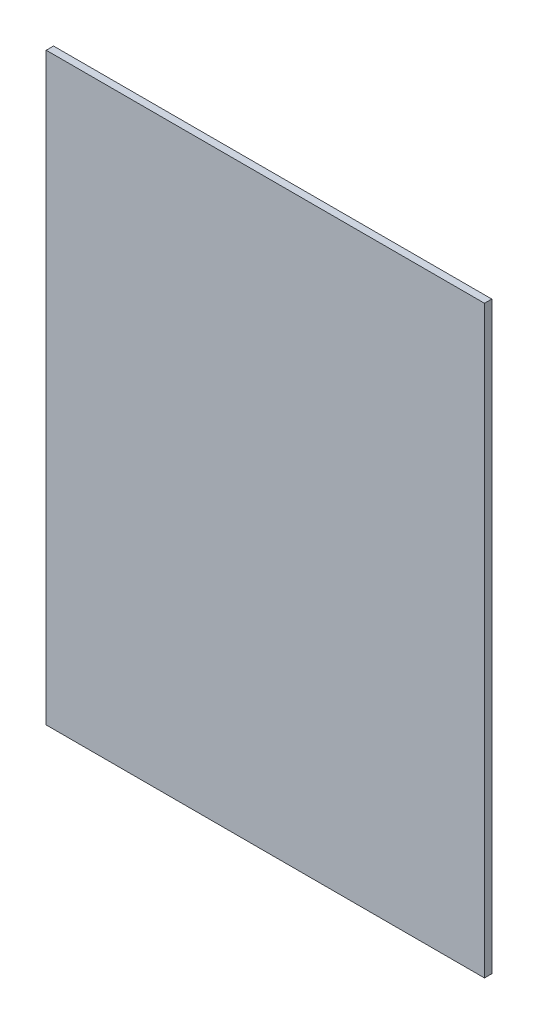
ISO-10303-21;
HEADER;
FILE_DESCRIPTION(('STEP AP214'),'2;1');
FILE_NAME('part.step','',(''),(''),'','','');
FILE_SCHEMA(('AUTOMOTIVE_DESIGN { 1 0 10303 214 1 1 1 1 }'));
ENDSEC;
DATA;
#1=APPLICATION_CONTEXT('core data for automotive mechanical design processes');
#2=APPLICATION_PROTOCOL_DEFINITION('international standard','automotive_design',2000,#1);
#3=PRODUCT_CONTEXT('',#1,'mechanical');
#4=PRODUCT('Part','Part','',(#3));
#5=PRODUCT_RELATED_PRODUCT_CATEGORY('part','',(#4));
#6=PRODUCT_DEFINITION_FORMATION('','',#4);
#7=PRODUCT_DEFINITION_CONTEXT('part definition',#1,'design');
#8=PRODUCT_DEFINITION('design','',#6,#7);
#9=PRODUCT_DEFINITION_SHAPE('','',#8);
#10=(LENGTH_UNIT() NAMED_UNIT(*) SI_UNIT(.MILLI.,.METRE.));
#11=(NAMED_UNIT(*) PLANE_ANGLE_UNIT() SI_UNIT($,.RADIAN.));
#12=(NAMED_UNIT(*) SI_UNIT($,.STERADIAN.) SOLID_ANGLE_UNIT());
#13=UNCERTAINTY_MEASURE_WITH_UNIT(LENGTH_MEASURE(1.E-05),#10,'distance_accuracy_value','');
#14=(GEOMETRIC_REPRESENTATION_CONTEXT(3) GLOBAL_UNCERTAINTY_ASSIGNED_CONTEXT((#13)) GLOBAL_UNIT_ASSIGNED_CONTEXT((#10,
#11,#12)) REPRESENTATION_CONTEXT('',''));
#15=CARTESIAN_POINT('',(0.,0.,0.));
#16=DIRECTION('',(0.,0.,1.));
#17=DIRECTION('',(1.,0.,0.));
#18=AXIS2_PLACEMENT_3D('',#15,#16,#17);
#19=CARTESIAN_POINT('',(-250.,400.,10.));
#20=DIRECTION('',(1.,0.,0.));
#21=DIRECTION('',(0.,1.,0.));
#22=AXIS2_PLACEMENT_3D('',#19,#20,#21);
#23=PLANE('',#22);
#24=DIRECTION('',(0.,-1.,0.));
#25=VECTOR('',#24,1.);
#26=CARTESIAN_POINT('',(-250.,400.,0.));
#27=LINE('',#26,#25);
#28=CARTESIAN_POINT('',(-250.,400.,0.));
#29=VERTEX_POINT('',#28);
#30=CARTESIAN_POINT('',(-250.,-400.,0.));
#31=VERTEX_POINT('',#30);
#32=EDGE_CURVE('E100',#29,#31,#27,.T.);
#33=ORIENTED_EDGE('',*,*,#32,.T.);
#34=DIRECTION('',(0.,0.,-1.));
#35=VECTOR('',#34,1.);
#36=CARTESIAN_POINT('',(-250.,-400.,10.));
#37=LINE('',#36,#35);
#38=CARTESIAN_POINT('',(-250.,-400.,10.));
#39=VERTEX_POINT('',#38);
#40=EDGE_CURVE('E11',#39,#31,#37,.T.);
#41=ORIENTED_EDGE('',*,*,#40,.F.);
#42=DIRECTION('',(0.,-1.,0.));
#43=VECTOR('',#42,1.);
#44=CARTESIAN_POINT('',(-250.,400.,10.));
#45=LINE('',#44,#43);
#46=CARTESIAN_POINT('',(-250.,400.,10.));
#47=VERTEX_POINT('',#46);
#48=EDGE_CURVE('E88',#47,#39,#45,.T.);
#49=ORIENTED_EDGE('',*,*,#48,.F.);
#50=DIRECTION('',(0.,0.,-1.));
#51=VECTOR('',#50,1.);
#52=CARTESIAN_POINT('',(-250.,400.,10.));
#53=LINE('',#52,#51);
#54=EDGE_CURVE('E96',#47,#29,#53,.T.);
#55=ORIENTED_EDGE('',*,*,#54,.T.);
#56=EDGE_LOOP('',(#33,#41,#49,#55));
#57=FACE_BOUND('',#56,.T.);
#58=ADVANCED_FACE('F37',(#57),#23,.F.);
#59=CARTESIAN_POINT('',(-250.,-400.,10.));
#60=DIRECTION('',(0.,1.,0.));
#61=DIRECTION('',(0.,0.,1.));
#62=AXIS2_PLACEMENT_3D('',#59,#60,#61);
#63=PLANE('',#62);
#64=DIRECTION('',(1.,0.,0.));
#65=VECTOR('',#64,1.);
#66=CARTESIAN_POINT('',(-250.,-400.,0.));
#67=LINE('',#66,#65);
#68=CARTESIAN_POINT('',(350.,-400.,0.));
#69=VERTEX_POINT('',#68);
#70=EDGE_CURVE('E92',#31,#69,#67,.T.);
#71=ORIENTED_EDGE('',*,*,#70,.T.);
#72=DIRECTION('',(0.,0.,-1.));
#73=VECTOR('',#72,1.);
#74=CARTESIAN_POINT('',(350.,-400.,10.));
#75=LINE('',#74,#73);
#76=CARTESIAN_POINT('',(350.,-400.,10.));
#77=VERTEX_POINT('',#76);
#78=EDGE_CURVE('E45',#77,#69,#75,.T.);
#79=ORIENTED_EDGE('',*,*,#78,.F.);
#80=DIRECTION('',(1.,0.,0.));
#81=VECTOR('',#80,1.);
#82=CARTESIAN_POINT('',(-250.,-400.,10.));
#83=LINE('',#82,#81);
#84=EDGE_CURVE('E83',#39,#77,#83,.T.);
#85=ORIENTED_EDGE('',*,*,#84,.F.);
#86=ORIENTED_EDGE('',*,*,#40,.T.);
#87=EDGE_LOOP('',(#71,#79,#85,#86));
#88=FACE_BOUND('',#87,.T.);
#89=ADVANCED_FACE('F91',(#88),#63,.F.);
#90=CARTESIAN_POINT('',(350.,400.,10.));
#91=DIRECTION('',(-1.,0.,0.));
#92=DIRECTION('',(0.,-1.,0.));
#93=AXIS2_PLACEMENT_3D('',#90,#91,#92);
#94=PLANE('',#93);
#95=DIRECTION('',(0.,1.,0.));
#96=VECTOR('',#95,1.);
#97=CARTESIAN_POINT('',(350.,400.,0.));
#98=LINE('',#97,#96);
#99=CARTESIAN_POINT('',(350.,400.,0.));
#100=VERTEX_POINT('',#99);
#101=EDGE_CURVE('E70',#69,#100,#98,.T.);
#102=ORIENTED_EDGE('',*,*,#101,.T.);
#103=DIRECTION('',(0.,0.,-1.));
#104=VECTOR('',#103,1.);
#105=CARTESIAN_POINT('',(350.,400.,10.));
#106=LINE('',#105,#104);
#107=CARTESIAN_POINT('',(350.,400.,10.));
#108=VERTEX_POINT('',#107);
#109=EDGE_CURVE('E93',#108,#100,#106,.T.);
#110=ORIENTED_EDGE('',*,*,#109,.F.);
#111=DIRECTION('',(0.,1.,0.));
#112=VECTOR('',#111,1.);
#113=CARTESIAN_POINT('',(350.,400.,10.));
#114=LINE('',#113,#112);
#115=EDGE_CURVE('E86',#77,#108,#114,.T.);
#116=ORIENTED_EDGE('',*,*,#115,.F.);
#117=ORIENTED_EDGE('',*,*,#78,.T.);
#118=EDGE_LOOP('',(#102,#110,#116,#117));
#119=FACE_BOUND('',#118,.T.);
#120=ADVANCED_FACE('F94',(#119),#94,.F.);
#121=CARTESIAN_POINT('',(-250.,400.,10.));
#122=DIRECTION('',(0.,-1.,0.));
#123=DIRECTION('',(0.,0.,-1.));
#124=AXIS2_PLACEMENT_3D('',#121,#122,#123);
#125=PLANE('',#124);
#126=DIRECTION('',(-1.,0.,0.));
#127=VECTOR('',#126,1.);
#128=CARTESIAN_POINT('',(-250.,400.,0.));
#129=LINE('',#128,#127);
#130=EDGE_CURVE('E76',#100,#29,#129,.T.);
#131=ORIENTED_EDGE('',*,*,#130,.T.);
#132=ORIENTED_EDGE('',*,*,#54,.F.);
#133=DIRECTION('',(-1.,0.,0.));
#134=VECTOR('',#133,1.);
#135=CARTESIAN_POINT('',(-250.,400.,10.));
#136=LINE('',#135,#134);
#137=EDGE_CURVE('E53',#108,#47,#136,.T.);
#138=ORIENTED_EDGE('',*,*,#137,.F.);
#139=ORIENTED_EDGE('',*,*,#109,.T.);
#140=EDGE_LOOP('',(#131,#132,#138,#139));
#141=FACE_BOUND('',#140,.T.);
#142=ADVANCED_FACE('F107',(#141),#125,.F.);
#143=CARTESIAN_POINT('',(0.,0.,10.));
#144=DIRECTION('',(0.,0.,1.));
#145=DIRECTION('',(1.,0.,0.));
#146=AXIS2_PLACEMENT_3D('',#143,#144,#145);
#147=PLANE('',#146);
#148=ORIENTED_EDGE('',*,*,#48,.T.);
#149=ORIENTED_EDGE('',*,*,#84,.T.);
#150=ORIENTED_EDGE('',*,*,#115,.T.);
#151=ORIENTED_EDGE('',*,*,#137,.T.);
#152=EDGE_LOOP('',(#148,#149,#150,#151));
#153=FACE_BOUND('',#152,.T.);
#154=ADVANCED_FACE('F84',(#153),#147,.T.);
#155=CARTESIAN_POINT('',(0.,0.,0.));
#156=DIRECTION('',(0.,0.,1.));
#157=DIRECTION('',(1.,0.,0.));
#158=AXIS2_PLACEMENT_3D('',#155,#156,#157);
#159=PLANE('',#158);
#160=ORIENTED_EDGE('',*,*,#32,.F.);
#161=ORIENTED_EDGE('',*,*,#130,.F.);
#162=ORIENTED_EDGE('',*,*,#101,.F.);
#163=ORIENTED_EDGE('',*,*,#70,.F.);
#164=EDGE_LOOP('',(#160,#161,#162,#163));
#165=FACE_BOUND('',#164,.T.);
#166=ADVANCED_FACE('F110',(#165),#159,.F.);
#167=CLOSED_SHELL('',(#58,#89,#120,#142,#154,#166));
#168=MANIFOLD_SOLID_BREP('B2',#167);
#169=ADVANCED_BREP_SHAPE_REPRESENTATION('',(#18,#168),#14);
#170=SHAPE_DEFINITION_REPRESENTATION(#9,#169);
ENDSEC;
END-ISO-10303-21;
